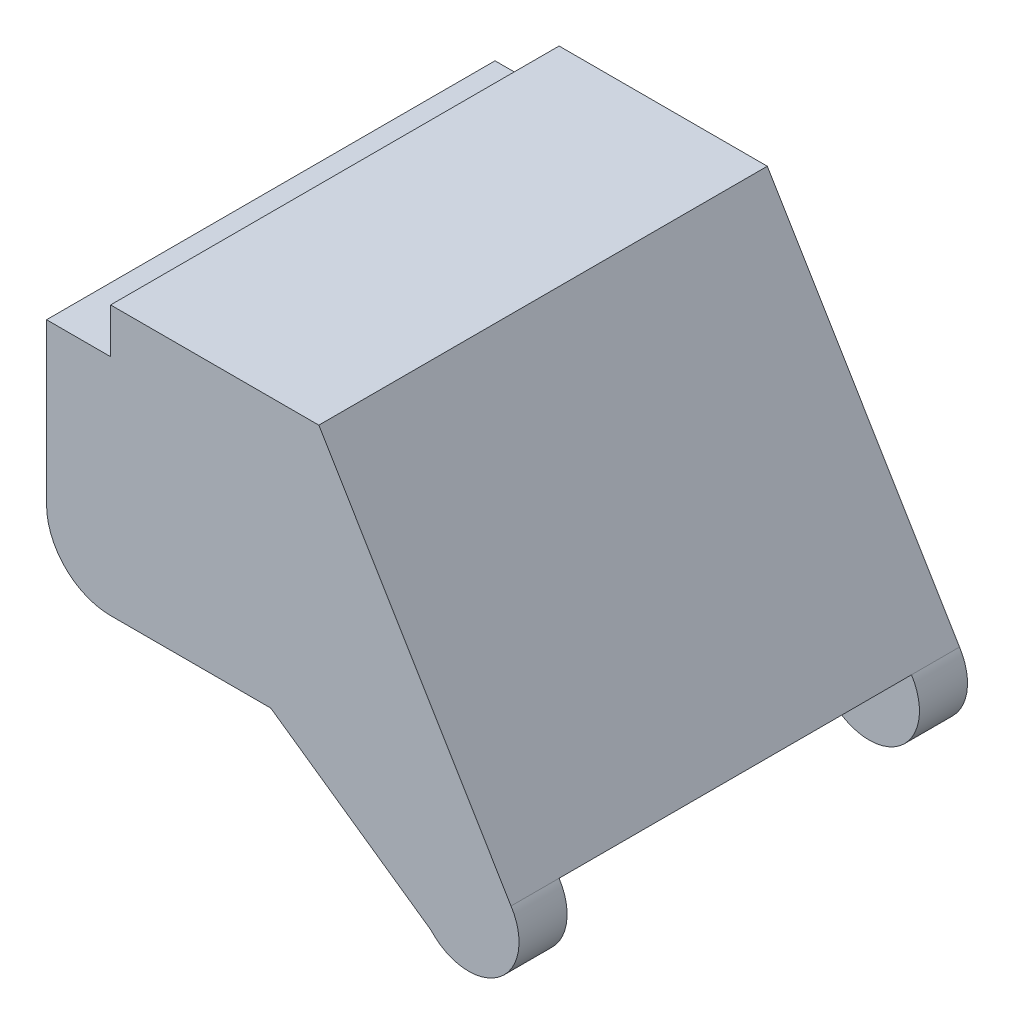
ISO-10303-21;
HEADER;
FILE_DESCRIPTION(('STEP AP214'),'2;1');
FILE_NAME('part.step','',(''),(''),'','','');
FILE_SCHEMA(('AUTOMOTIVE_DESIGN { 1 0 10303 214 1 1 1 1 }'));
ENDSEC;
DATA;
#1=APPLICATION_CONTEXT('core data for automotive mechanical design processes');
#2=APPLICATION_PROTOCOL_DEFINITION('international standard','automotive_design',2000,#1);
#3=PRODUCT_CONTEXT('',#1,'mechanical');
#4=PRODUCT('Part','Part','',(#3));
#5=PRODUCT_RELATED_PRODUCT_CATEGORY('part','',(#4));
#6=PRODUCT_DEFINITION_FORMATION('','',#4);
#7=PRODUCT_DEFINITION_CONTEXT('part definition',#1,'design');
#8=PRODUCT_DEFINITION('design','',#6,#7);
#9=PRODUCT_DEFINITION_SHAPE('','',#8);
#10=(LENGTH_UNIT() NAMED_UNIT(*) SI_UNIT(.MILLI.,.METRE.));
#11=(NAMED_UNIT(*) PLANE_ANGLE_UNIT() SI_UNIT($,.RADIAN.));
#12=(NAMED_UNIT(*) SI_UNIT($,.STERADIAN.) SOLID_ANGLE_UNIT());
#13=UNCERTAINTY_MEASURE_WITH_UNIT(LENGTH_MEASURE(1.E-05),#10,'distance_accuracy_value','');
#14=(GEOMETRIC_REPRESENTATION_CONTEXT(3) GLOBAL_UNCERTAINTY_ASSIGNED_CONTEXT((#13)) GLOBAL_UNIT_ASSIGNED_CONTEXT((#10,
#11,#12)) REPRESENTATION_CONTEXT('',''));
#15=CARTESIAN_POINT('',(0.,0.,0.));
#16=DIRECTION('',(0.,0.,1.));
#17=DIRECTION('',(1.,0.,0.));
#18=AXIS2_PLACEMENT_3D('',#15,#16,#17);
#19=CARTESIAN_POINT('',(0.,7.,14.));
#20=DIRECTION('',(1.,0.,0.));
#21=DIRECTION('',(0.,1.,0.));
#22=AXIS2_PLACEMENT_3D('',#19,#20,#21);
#23=PLANE('',#22);
#24=DIRECTION('',(0.,-1.,0.));
#25=VECTOR('',#24,1.);
#26=CARTESIAN_POINT('',(0.,-2.45143228970305,1.5));
#27=LINE('',#26,#25);
#28=CARTESIAN_POINT('',(0.,5.5,1.5));
#29=VERTEX_POINT('',#28);
#30=CARTESIAN_POINT('',(0.,2.00000000000001,1.5));
#31=VERTEX_POINT('',#30);
#32=EDGE_CURVE('E365',#29,#31,#27,.T.);
#33=ORIENTED_EDGE('',*,*,#32,.F.);
#34=DIRECTION('',(0.,0.,-1.));
#35=VECTOR('',#34,1.);
#36=CARTESIAN_POINT('',(0.,5.5,14.));
#37=LINE('',#36,#35);
#38=CARTESIAN_POINT('',(0.,5.5,12.5));
#39=VERTEX_POINT('',#38);
#40=EDGE_CURVE('E165',#39,#29,#37,.T.);
#41=ORIENTED_EDGE('',*,*,#40,.F.);
#42=DIRECTION('',(0.,-1.,0.));
#43=VECTOR('',#42,1.);
#44=CARTESIAN_POINT('',(0.,-2.45143228970305,12.5));
#45=LINE('',#44,#43);
#46=CARTESIAN_POINT('',(0.,2.00000000000001,12.5));
#47=VERTEX_POINT('',#46);
#48=EDGE_CURVE('E268',#39,#47,#45,.T.);
#49=ORIENTED_EDGE('',*,*,#48,.T.);
#50=DIRECTION('',(0.,0.,-1.));
#51=VECTOR('',#50,1.);
#52=CARTESIAN_POINT('',(0.,2.00000000000001,14.));
#53=LINE('',#52,#51);
#54=CARTESIAN_POINT('',(0.,2.00000000000001,14.));
#55=VERTEX_POINT('',#54);
#56=EDGE_CURVE('E50',#55,#47,#53,.T.);
#57=ORIENTED_EDGE('',*,*,#56,.F.);
#58=DIRECTION('',(0.,-1.,0.));
#59=VECTOR('',#58,1.);
#60=CARTESIAN_POINT('',(0.,7.,14.));
#61=LINE('',#60,#59);
#62=CARTESIAN_POINT('',(0.,7.,14.));
#63=VERTEX_POINT('',#62);
#64=EDGE_CURVE('E110',#63,#55,#61,.T.);
#65=ORIENTED_EDGE('',*,*,#64,.F.);
#66=DIRECTION('',(0.,0.,-1.));
#67=VECTOR('',#66,1.);
#68=CARTESIAN_POINT('',(0.,7.,14.));
#69=LINE('',#68,#67);
#70=CARTESIAN_POINT('',(0.,7.,0.));
#71=VERTEX_POINT('',#70);
#72=EDGE_CURVE('E11',#63,#71,#69,.T.);
#73=ORIENTED_EDGE('',*,*,#72,.T.);
#74=DIRECTION('',(0.,-1.,0.));
#75=VECTOR('',#74,1.);
#76=CARTESIAN_POINT('',(0.,7.,0.));
#77=LINE('',#76,#75);
#78=CARTESIAN_POINT('',(0.,2.00000000000001,0.));
#79=VERTEX_POINT('',#78);
#80=EDGE_CURVE('E164',#71,#79,#77,.T.);
#81=ORIENTED_EDGE('',*,*,#80,.T.);
#82=EDGE_CURVE('E215',#31,#79,#53,.T.);
#83=ORIENTED_EDGE('',*,*,#82,.F.);
#84=EDGE_LOOP('',(#33,#41,#49,#57,#65,#73,#81,#83));
#85=FACE_BOUND('',#84,.T.);
#86=ADVANCED_FACE('F41',(#85),#23,.F.);
#87=CARTESIAN_POINT('',(2.,2.,14.));
#88=DIRECTION('',(0.,0.,-1.));
#89=DIRECTION('',(-1.,0.,0.));
#90=AXIS2_PLACEMENT_3D('',#87,#88,#89);
#91=CYLINDRICAL_SURFACE('',#90,2.);
#92=CARTESIAN_POINT('',(2.,2.,1.5));
#93=DIRECTION('',(0.,0.,-1.));
#94=DIRECTION('',(-1.,0.,0.));
#95=AXIS2_PLACEMENT_3D('',#92,#93,#94);
#96=CIRCLE('',#95,2.);
#97=CARTESIAN_POINT('',(2.00000000000001,0.,1.5));
#98=VERTEX_POINT('',#97);
#99=EDGE_CURVE('E232',#31,#98,#96,.F.);
#100=ORIENTED_EDGE('',*,*,#99,.F.);
#101=ORIENTED_EDGE('',*,*,#82,.T.);
#102=CARTESIAN_POINT('',(2.,2.,0.));
#103=DIRECTION('',(0.,0.,1.));
#104=DIRECTION('',(1.,0.,0.));
#105=AXIS2_PLACEMENT_3D('',#102,#103,#104);
#106=CIRCLE('',#105,2.);
#107=CARTESIAN_POINT('',(2.00000000000001,0.,0.));
#108=VERTEX_POINT('',#107);
#109=EDGE_CURVE('E169',#79,#108,#106,.T.);
#110=ORIENTED_EDGE('',*,*,#109,.T.);
#111=DIRECTION('',(0.,0.,-1.));
#112=VECTOR('',#111,1.);
#113=CARTESIAN_POINT('',(2.00000000000001,0.,14.));
#114=LINE('',#113,#112);
#115=EDGE_CURVE('E211',#98,#108,#114,.T.);
#116=ORIENTED_EDGE('',*,*,#115,.F.);
#117=EDGE_LOOP('',(#100,#101,#110,#116));
#118=FACE_BOUND('',#117,.T.);
#119=ADVANCED_FACE('F226',(#118),#91,.T.);
#120=CARTESIAN_POINT('',(2.00000000000001,0.,14.));
#121=DIRECTION('',(0.,1.,0.));
#122=DIRECTION('',(0.,0.,1.));
#123=AXIS2_PLACEMENT_3D('',#120,#121,#122);
#124=PLANE('',#123);
#125=DIRECTION('',(1.,0.,0.));
#126=VECTOR('',#125,1.);
#127=CARTESIAN_POINT('',(13.1750885401743,0.,1.5));
#128=LINE('',#127,#126);
#129=CARTESIAN_POINT('',(7.,0.,1.5));
#130=VERTEX_POINT('',#129);
#131=EDGE_CURVE('E247',#98,#130,#128,.T.);
#132=ORIENTED_EDGE('',*,*,#131,.F.);
#133=ORIENTED_EDGE('',*,*,#115,.T.);
#134=DIRECTION('',(1.,0.,0.));
#135=VECTOR('',#134,1.);
#136=CARTESIAN_POINT('',(2.00000000000001,0.,0.));
#137=LINE('',#136,#135);
#138=CARTESIAN_POINT('',(7.,0.,0.));
#139=VERTEX_POINT('',#138);
#140=EDGE_CURVE('E173',#108,#139,#137,.T.);
#141=ORIENTED_EDGE('',*,*,#140,.T.);
#142=DIRECTION('',(0.,0.,-1.));
#143=VECTOR('',#142,1.);
#144=CARTESIAN_POINT('',(7.,0.,14.));
#145=LINE('',#144,#143);
#146=EDGE_CURVE('E206',#130,#139,#145,.T.);
#147=ORIENTED_EDGE('',*,*,#146,.F.);
#148=EDGE_LOOP('',(#132,#133,#141,#147));
#149=FACE_BOUND('',#148,.T.);
#150=ADVANCED_FACE('F243',(#149),#124,.F.);
#151=CARTESIAN_POINT('',(7.,0.,14.));
#152=DIRECTION('',(0.573462344363328,0.819231920519041,0.));
#153=DIRECTION('',(-0.819231920519041,0.573462344363328,0.));
#154=AXIS2_PLACEMENT_3D('',#151,#152,#153);
#155=PLANE('',#154);
#156=DIRECTION('',(0.819231920519041,-0.573462344363328,0.));
#157=VECTOR('',#156,1.);
#158=CARTESIAN_POINT('',(12.2960343241386,-3.707224026897,1.5));
#159=LINE('',#158,#157);
#160=CARTESIAN_POINT('',(12.,-3.5,1.5));
#161=VERTEX_POINT('',#160);
#162=EDGE_CURVE('E373',#130,#161,#159,.T.);
#163=ORIENTED_EDGE('',*,*,#162,.F.);
#164=ORIENTED_EDGE('',*,*,#146,.T.);
#165=DIRECTION('',(0.819231920519041,-0.573462344363328,0.));
#166=VECTOR('',#165,1.);
#167=CARTESIAN_POINT('',(7.,0.,0.));
#168=LINE('',#167,#166);
#169=CARTESIAN_POINT('',(12.,-3.5,0.));
#170=VERTEX_POINT('',#169);
#171=EDGE_CURVE('E177',#139,#170,#168,.T.);
#172=ORIENTED_EDGE('',*,*,#171,.T.);
#173=DIRECTION('',(0.,0.,-1.));
#174=VECTOR('',#173,1.);
#175=CARTESIAN_POINT('',(12.,-3.5,14.));
#176=LINE('',#175,#174);
#177=EDGE_CURVE('E200',#161,#170,#176,.T.);
#178=ORIENTED_EDGE('',*,*,#177,.F.);
#179=EDGE_LOOP('',(#163,#164,#172,#178));
#180=FACE_BOUND('',#179,.T.);
#181=ADVANCED_FACE('F456',(#180),#155,.F.);
#182=CARTESIAN_POINT('',(13.1750885401743,-2.45143228970307,14.));
#183=DIRECTION('',(0.,0.,-1.));
#184=DIRECTION('',(-1.,0.,0.));
#185=AXIS2_PLACEMENT_3D('',#182,#183,#184);
#186=CYLINDRICAL_SURFACE('',#185,1.57490549568106);
#187=CARTESIAN_POINT('',(13.1750885401743,-2.45143228970307,1.5));
#188=DIRECTION('',(0.,0.,-1.));
#189=DIRECTION('',(-1.,0.,0.));
#190=AXIS2_PLACEMENT_3D('',#187,#188,#189);
#191=CIRCLE('',#190,1.57490549568106);
#192=CARTESIAN_POINT('',(14.5,-1.6,1.5));
#193=VERTEX_POINT('',#192);
#194=EDGE_CURVE('E361',#161,#193,#191,.F.);
#195=ORIENTED_EDGE('',*,*,#194,.F.);
#196=ORIENTED_EDGE('',*,*,#177,.T.);
#197=CARTESIAN_POINT('',(13.1750885401743,-2.45143228970307,0.));
#198=DIRECTION('',(0.,0.,1.));
#199=DIRECTION('',(-1.,0.,0.));
#200=AXIS2_PLACEMENT_3D('',#197,#198,#199);
#201=CIRCLE('',#200,1.57490549568106);
#202=CARTESIAN_POINT('',(14.5,-1.6,0.));
#203=VERTEX_POINT('',#202);
#204=EDGE_CURVE('E181',#170,#203,#201,.T.);
#205=ORIENTED_EDGE('',*,*,#204,.T.);
#206=DIRECTION('',(0.,0.,-1.));
#207=VECTOR('',#206,1.);
#208=CARTESIAN_POINT('',(14.5,-1.6,14.));
#209=LINE('',#208,#207);
#210=EDGE_CURVE('E149',#193,#203,#209,.T.);
#211=ORIENTED_EDGE('',*,*,#210,.F.);
#212=EDGE_LOOP('',(#195,#196,#205,#211));
#213=FACE_BOUND('',#212,.T.);
#214=ADVANCED_FACE('F257',(#213),#186,.T.);
#215=CARTESIAN_POINT('',(0.,7.,14.));
#216=DIRECTION('',(0.,-1.,0.));
#217=DIRECTION('',(0.,0.,-1.));
#218=AXIS2_PLACEMENT_3D('',#215,#216,#217);
#219=PLANE('',#218);
#220=DIRECTION('',(-1.,0.,0.));
#221=VECTOR('',#220,1.);
#222=CARTESIAN_POINT('',(0.,7.,0.));
#223=LINE('',#222,#221);
#224=CARTESIAN_POINT('',(2.,7.,0.));
#225=VERTEX_POINT('',#224);
#226=EDGE_CURVE('E160',#225,#71,#223,.T.);
#227=ORIENTED_EDGE('',*,*,#226,.T.);
#228=ORIENTED_EDGE('',*,*,#72,.F.);
#229=DIRECTION('',(-1.,0.,0.));
#230=VECTOR('',#229,1.);
#231=CARTESIAN_POINT('',(0.,7.,14.));
#232=LINE('',#231,#230);
#233=CARTESIAN_POINT('',(2.,7.,14.));
#234=VERTEX_POINT('',#233);
#235=EDGE_CURVE('E192',#234,#63,#232,.T.);
#236=ORIENTED_EDGE('',*,*,#235,.F.);
#237=DIRECTION('',(0.,0.,-1.));
#238=VECTOR('',#237,1.);
#239=CARTESIAN_POINT('',(2.,7.,14.));
#240=LINE('',#239,#238);
#241=EDGE_CURVE('E156',#234,#225,#240,.T.);
#242=ORIENTED_EDGE('',*,*,#241,.T.);
#243=EDGE_LOOP('',(#227,#228,#236,#242));
#244=FACE_BOUND('',#243,.T.);
#245=ADVANCED_FACE('F43',(#244),#219,.F.);
#246=ORIENTED_EDGE('',*,*,#56,.T.);
#247=CARTESIAN_POINT('',(2.,2.,12.5));
#248=DIRECTION('',(0.,0.,-1.));
#249=DIRECTION('',(-1.,0.,0.));
#250=AXIS2_PLACEMENT_3D('',#247,#248,#249);
#251=CIRCLE('',#250,2.);
#252=CARTESIAN_POINT('',(2.00000000000001,0.,12.5));
#253=VERTEX_POINT('',#252);
#254=EDGE_CURVE('E310',#47,#253,#251,.F.);
#255=ORIENTED_EDGE('',*,*,#254,.T.);
#256=CARTESIAN_POINT('',(2.00000000000001,0.,14.));
#257=VERTEX_POINT('',#256);
#258=EDGE_CURVE('E212',#257,#253,#114,.T.);
#259=ORIENTED_EDGE('',*,*,#258,.F.);
#260=CARTESIAN_POINT('',(2.,2.,14.));
#261=DIRECTION('',(0.,0.,1.));
#262=DIRECTION('',(1.,0.,0.));
#263=AXIS2_PLACEMENT_3D('',#260,#261,#262);
#264=CIRCLE('',#263,2.);
#265=EDGE_CURVE('E265',#55,#257,#264,.T.);
#266=ORIENTED_EDGE('',*,*,#265,.F.);
#267=EDGE_LOOP('',(#246,#255,#259,#266));
#268=FACE_BOUND('',#267,.T.);
#269=ADVANCED_FACE('F433',(#268),#91,.T.);
#270=ORIENTED_EDGE('',*,*,#258,.T.);
#271=DIRECTION('',(1.,0.,0.));
#272=VECTOR('',#271,1.);
#273=CARTESIAN_POINT('',(13.1750885401743,0.,12.5));
#274=LINE('',#273,#272);
#275=CARTESIAN_POINT('',(7.,0.,12.5));
#276=VERTEX_POINT('',#275);
#277=EDGE_CURVE('E307',#253,#276,#274,.T.);
#278=ORIENTED_EDGE('',*,*,#277,.T.);
#279=CARTESIAN_POINT('',(7.,0.,14.));
#280=VERTEX_POINT('',#279);
#281=EDGE_CURVE('E207',#280,#276,#145,.T.);
#282=ORIENTED_EDGE('',*,*,#281,.F.);
#283=DIRECTION('',(1.,0.,0.));
#284=VECTOR('',#283,1.);
#285=CARTESIAN_POINT('',(2.00000000000001,0.,14.));
#286=LINE('',#285,#284);
#287=EDGE_CURVE('E273',#257,#280,#286,.T.);
#288=ORIENTED_EDGE('',*,*,#287,.F.);
#289=EDGE_LOOP('',(#270,#278,#282,#288));
#290=FACE_BOUND('',#289,.T.);
#291=ADVANCED_FACE('F432',(#290),#124,.F.);
#292=ORIENTED_EDGE('',*,*,#281,.T.);
#293=DIRECTION('',(0.819231920519041,-0.573462344363328,0.));
#294=VECTOR('',#293,1.);
#295=CARTESIAN_POINT('',(12.2960343241386,-3.707224026897,12.5));
#296=LINE('',#295,#294);
#297=CARTESIAN_POINT('',(12.,-3.5,12.5));
#298=VERTEX_POINT('',#297);
#299=EDGE_CURVE('E288',#276,#298,#296,.T.);
#300=ORIENTED_EDGE('',*,*,#299,.T.);
#301=CARTESIAN_POINT('',(12.,-3.5,14.));
#302=VERTEX_POINT('',#301);
#303=EDGE_CURVE('E202',#302,#298,#176,.T.);
#304=ORIENTED_EDGE('',*,*,#303,.F.);
#305=DIRECTION('',(0.819231920519041,-0.573462344363328,0.));
#306=VECTOR('',#305,1.);
#307=CARTESIAN_POINT('',(7.,0.,14.));
#308=LINE('',#307,#306);
#309=EDGE_CURVE('E276',#280,#302,#308,.T.);
#310=ORIENTED_EDGE('',*,*,#309,.F.);
#311=EDGE_LOOP('',(#292,#300,#304,#310));
#312=FACE_BOUND('',#311,.T.);
#313=ADVANCED_FACE('F285',(#312),#155,.F.);
#314=ORIENTED_EDGE('',*,*,#303,.T.);
#315=CARTESIAN_POINT('',(13.1750885401743,-2.45143228970307,12.5));
#316=DIRECTION('',(0.,0.,-1.));
#317=DIRECTION('',(-1.,0.,0.));
#318=AXIS2_PLACEMENT_3D('',#315,#316,#317);
#319=CIRCLE('',#318,1.57490549568106);
#320=CARTESIAN_POINT('',(14.5,-1.6,12.5));
#321=VERTEX_POINT('',#320);
#322=EDGE_CURVE('E292',#298,#321,#319,.F.);
#323=ORIENTED_EDGE('',*,*,#322,.T.);
#324=CARTESIAN_POINT('',(14.5,-1.6,14.));
#325=VERTEX_POINT('',#324);
#326=EDGE_CURVE('E197',#325,#321,#209,.T.);
#327=ORIENTED_EDGE('',*,*,#326,.F.);
#328=CARTESIAN_POINT('',(13.1750885401743,-2.45143228970307,14.));
#329=DIRECTION('',(0.,0.,1.));
#330=DIRECTION('',(-1.,0.,0.));
#331=AXIS2_PLACEMENT_3D('',#328,#329,#330);
#332=CIRCLE('',#331,1.57490549568106);
#333=EDGE_CURVE('E135',#302,#325,#332,.T.);
#334=ORIENTED_EDGE('',*,*,#333,.F.);
#335=EDGE_LOOP('',(#314,#323,#327,#334));
#336=FACE_BOUND('',#335,.T.);
#337=ADVANCED_FACE('F291',(#336),#186,.T.);
#338=CARTESIAN_POINT('',(8.5,8.4,14.));
#339=DIRECTION('',(-0.857492925712544,-0.514495755427527,0.));
#340=DIRECTION('',(0.514495755427527,-0.857492925712544,0.));
#341=AXIS2_PLACEMENT_3D('',#338,#339,#340);
#342=PLANE('',#341);
#343=DIRECTION('',(-0.514495755427527,0.857492925712544,0.));
#344=VECTOR('',#343,1.);
#345=CARTESIAN_POINT('',(8.5,8.4,0.));
#346=LINE('',#345,#344);
#347=CARTESIAN_POINT('',(8.5,8.4,0.));
#348=VERTEX_POINT('',#347);
#349=EDGE_CURVE('E145',#203,#348,#346,.T.);
#350=ORIENTED_EDGE('',*,*,#349,.T.);
#351=DIRECTION('',(0.,0.,-1.));
#352=VECTOR('',#351,1.);
#353=CARTESIAN_POINT('',(8.5,8.4,14.));
#354=LINE('',#353,#352);
#355=CARTESIAN_POINT('',(8.5,8.4,14.));
#356=VERTEX_POINT('',#355);
#357=EDGE_CURVE('E142',#356,#348,#354,.T.);
#358=ORIENTED_EDGE('',*,*,#357,.F.);
#359=DIRECTION('',(-0.514495755427527,0.857492925712544,0.));
#360=VECTOR('',#359,1.);
#361=CARTESIAN_POINT('',(8.5,8.4,14.));
#362=LINE('',#361,#360);
#363=EDGE_CURVE('E128',#325,#356,#362,.T.);
#364=ORIENTED_EDGE('',*,*,#363,.F.);
#365=ORIENTED_EDGE('',*,*,#326,.T.);
#366=EDGE_CURVE('E201',#321,#193,#209,.T.);
#367=ORIENTED_EDGE('',*,*,#366,.T.);
#368=ORIENTED_EDGE('',*,*,#210,.T.);
#369=EDGE_LOOP('',(#350,#358,#364,#365,#367,#368));
#370=FACE_BOUND('',#369,.T.);
#371=ADVANCED_FACE('F143',(#370),#342,.F.);
#372=CARTESIAN_POINT('',(2.,8.4,14.));
#373=DIRECTION('',(0.,-1.,0.));
#374=DIRECTION('',(0.,0.,-1.));
#375=AXIS2_PLACEMENT_3D('',#372,#373,#374);
#376=PLANE('',#375);
#377=DIRECTION('',(-1.,0.,0.));
#378=VECTOR('',#377,1.);
#379=CARTESIAN_POINT('',(2.,8.4,0.));
#380=LINE('',#379,#378);
#381=CARTESIAN_POINT('',(2.,8.4,0.));
#382=VERTEX_POINT('',#381);
#383=EDGE_CURVE('E187',#348,#382,#380,.T.);
#384=ORIENTED_EDGE('',*,*,#383,.T.);
#385=DIRECTION('',(0.,0.,-1.));
#386=VECTOR('',#385,1.);
#387=CARTESIAN_POINT('',(2.,8.4,14.));
#388=LINE('',#387,#386);
#389=CARTESIAN_POINT('',(2.,8.4,14.));
#390=VERTEX_POINT('',#389);
#391=EDGE_CURVE('E150',#390,#382,#388,.T.);
#392=ORIENTED_EDGE('',*,*,#391,.F.);
#393=DIRECTION('',(-1.,0.,0.));
#394=VECTOR('',#393,1.);
#395=CARTESIAN_POINT('',(2.,8.4,14.));
#396=LINE('',#395,#394);
#397=EDGE_CURVE('E132',#356,#390,#396,.T.);
#398=ORIENTED_EDGE('',*,*,#397,.F.);
#399=ORIENTED_EDGE('',*,*,#357,.T.);
#400=EDGE_LOOP('',(#384,#392,#398,#399));
#401=FACE_BOUND('',#400,.T.);
#402=ADVANCED_FACE('F152',(#401),#376,.F.);
#403=CARTESIAN_POINT('',(2.,7.,14.));
#404=DIRECTION('',(1.,0.,0.));
#405=DIRECTION('',(0.,0.,-1.));
#406=AXIS2_PLACEMENT_3D('',#403,#404,#405);
#407=PLANE('',#406);
#408=DIRECTION('',(0.,-1.,0.));
#409=VECTOR('',#408,1.);
#410=CARTESIAN_POINT('',(2.,7.,0.));
#411=LINE('',#410,#409);
#412=EDGE_CURVE('E102',#382,#225,#411,.T.);
#413=ORIENTED_EDGE('',*,*,#412,.T.);
#414=ORIENTED_EDGE('',*,*,#241,.F.);
#415=DIRECTION('',(0.,-1.,0.));
#416=VECTOR('',#415,1.);
#417=CARTESIAN_POINT('',(2.,7.,14.));
#418=LINE('',#417,#416);
#419=EDGE_CURVE('E66',#390,#234,#418,.T.);
#420=ORIENTED_EDGE('',*,*,#419,.F.);
#421=ORIENTED_EDGE('',*,*,#391,.T.);
#422=EDGE_LOOP('',(#413,#414,#420,#421));
#423=FACE_BOUND('',#422,.T.);
#424=ADVANCED_FACE('F259',(#423),#407,.F.);
#425=CARTESIAN_POINT('',(13.1750885401743,-2.45143228970307,14.));
#426=DIRECTION('',(0.,0.,-1.));
#427=DIRECTION('',(-1.,0.,0.));
#428=AXIS2_PLACEMENT_3D('',#425,#426,#427);
#429=PLANE('',#428);
#430=ORIENTED_EDGE('',*,*,#235,.T.);
#431=ORIENTED_EDGE('',*,*,#64,.T.);
#432=ORIENTED_EDGE('',*,*,#265,.T.);
#433=ORIENTED_EDGE('',*,*,#287,.T.);
#434=ORIENTED_EDGE('',*,*,#309,.T.);
#435=ORIENTED_EDGE('',*,*,#333,.T.);
#436=ORIENTED_EDGE('',*,*,#363,.T.);
#437=ORIENTED_EDGE('',*,*,#397,.T.);
#438=ORIENTED_EDGE('',*,*,#419,.T.);
#439=EDGE_LOOP('',(#430,#431,#432,#433,#434,#435,#436,#437,#438));
#440=FACE_BOUND('',#439,.T.);
#441=ADVANCED_FACE('F130',(#440),#429,.F.);
#442=CARTESIAN_POINT('',(13.1750885401743,-2.45143228970307,0.));
#443=DIRECTION('',(0.,0.,-1.));
#444=DIRECTION('',(-1.,0.,0.));
#445=AXIS2_PLACEMENT_3D('',#442,#443,#444);
#446=PLANE('',#445);
#447=ORIENTED_EDGE('',*,*,#226,.F.);
#448=ORIENTED_EDGE('',*,*,#412,.F.);
#449=ORIENTED_EDGE('',*,*,#383,.F.);
#450=ORIENTED_EDGE('',*,*,#349,.F.);
#451=ORIENTED_EDGE('',*,*,#204,.F.);
#452=ORIENTED_EDGE('',*,*,#171,.F.);
#453=ORIENTED_EDGE('',*,*,#140,.F.);
#454=ORIENTED_EDGE('',*,*,#109,.F.);
#455=ORIENTED_EDGE('',*,*,#80,.F.);
#456=EDGE_LOOP('',(#447,#448,#449,#450,#451,#452,#453,#454,#455));
#457=FACE_BOUND('',#456,.T.);
#458=ADVANCED_FACE('F237',(#457),#446,.T.);
#459=CARTESIAN_POINT('',(0.,5.5,14.));
#460=DIRECTION('',(0.,-1.,0.));
#461=DIRECTION('',(0.,0.,-1.));
#462=AXIS2_PLACEMENT_3D('',#459,#460,#461);
#463=PLANE('',#462);
#464=DIRECTION('',(-1.,0.,0.));
#465=VECTOR('',#464,1.);
#466=CARTESIAN_POINT('',(13.1750885401743,5.5,1.5));
#467=LINE('',#466,#465);
#468=CARTESIAN_POINT('',(3.5,5.5,1.5));
#469=VERTEX_POINT('',#468);
#470=EDGE_CURVE('E335',#469,#29,#467,.T.);
#471=ORIENTED_EDGE('',*,*,#470,.F.);
#472=DIRECTION('',(0.,0.,-1.));
#473=VECTOR('',#472,1.);
#474=CARTESIAN_POINT('',(3.5,5.5,14.));
#475=LINE('',#474,#473);
#476=CARTESIAN_POINT('',(3.5,5.5,12.5));
#477=VERTEX_POINT('',#476);
#478=EDGE_CURVE('E336',#477,#469,#475,.T.);
#479=ORIENTED_EDGE('',*,*,#478,.F.);
#480=DIRECTION('',(-1.,0.,0.));
#481=VECTOR('',#480,1.);
#482=CARTESIAN_POINT('',(13.1750885401743,5.5,12.5));
#483=LINE('',#482,#481);
#484=EDGE_CURVE('E317',#477,#39,#483,.T.);
#485=ORIENTED_EDGE('',*,*,#484,.T.);
#486=ORIENTED_EDGE('',*,*,#40,.T.);
#487=EDGE_LOOP('',(#471,#479,#485,#486));
#488=FACE_BOUND('',#487,.T.);
#489=ADVANCED_FACE('F507',(#488),#463,.T.);
#490=CARTESIAN_POINT('',(13.1750885401743,-2.45143228970307,14.));
#491=DIRECTION('',(0.,0.,-1.));
#492=DIRECTION('',(-1.,0.,0.));
#493=AXIS2_PLACEMENT_3D('',#490,#491,#492);
#494=CYLINDRICAL_SURFACE('',#493,1.57490549568106);
#495=CARTESIAN_POINT('',(12.4292972966759,-1.06430477521585,12.5));
#496=VERTEX_POINT('',#495);
#497=EDGE_CURVE('E57',#321,#496,#319,.F.);
#498=ORIENTED_EDGE('',*,*,#497,.T.);
#499=DIRECTION('',(0.,0.,-1.));
#500=VECTOR('',#499,1.);
#501=CARTESIAN_POINT('',(12.4292972966759,-1.06430477521585,12.5));
#502=LINE('',#501,#500);
#503=CARTESIAN_POINT('',(12.4292972966759,-1.06430477521585,1.5));
#504=VERTEX_POINT('',#503);
#505=EDGE_CURVE('E303',#496,#504,#502,.T.);
#506=ORIENTED_EDGE('',*,*,#505,.T.);
#507=EDGE_CURVE('E376',#193,#504,#191,.F.);
#508=ORIENTED_EDGE('',*,*,#507,.F.);
#509=ORIENTED_EDGE('',*,*,#366,.F.);
#510=EDGE_LOOP('',(#498,#506,#508,#509));
#511=FACE_BOUND('',#510,.T.);
#512=ADVANCED_FACE('F393',(#511),#494,.F.);
#513=CARTESIAN_POINT('',(7.21376061143118,7.62825636685871,14.));
#514=DIRECTION('',(-0.857492925712544,-0.514495755427527,0.));
#515=DIRECTION('',(0.514495755427527,-0.857492925712544,0.));
#516=AXIS2_PLACEMENT_3D('',#513,#514,#515);
#517=PLANE('',#516);
#518=DIRECTION('',(-0.514495755427527,0.857492925712544,0.));
#519=VECTOR('',#518,1.);
#520=CARTESIAN_POINT('',(13.2386806469346,-2.41327702564693,1.5));
#521=LINE('',#520,#519);
#522=CARTESIAN_POINT('',(7.65071443154641,6.9,1.5));
#523=VERTEX_POINT('',#522);
#524=EDGE_CURVE('E352',#504,#523,#521,.T.);
#525=ORIENTED_EDGE('',*,*,#524,.F.);
#526=ORIENTED_EDGE('',*,*,#505,.F.);
#527=DIRECTION('',(-0.514495755427527,0.857492925712544,0.));
#528=VECTOR('',#527,1.);
#529=CARTESIAN_POINT('',(13.2386806469346,-2.41327702564693,12.5));
#530=LINE('',#529,#528);
#531=CARTESIAN_POINT('',(7.65071443154641,6.9,12.5));
#532=VERTEX_POINT('',#531);
#533=EDGE_CURVE('E294',#496,#532,#530,.T.);
#534=ORIENTED_EDGE('',*,*,#533,.T.);
#535=DIRECTION('',(0.,0.,-1.));
#536=VECTOR('',#535,1.);
#537=CARTESIAN_POINT('',(7.65071443154641,6.9,14.));
#538=LINE('',#537,#536);
#539=EDGE_CURVE('E348',#532,#523,#538,.T.);
#540=ORIENTED_EDGE('',*,*,#539,.T.);
#541=EDGE_LOOP('',(#525,#526,#534,#540));
#542=FACE_BOUND('',#541,.T.);
#543=ADVANCED_FACE('F397',(#542),#517,.T.);
#544=CARTESIAN_POINT('',(2.,6.9,14.));
#545=DIRECTION('',(0.,-1.,0.));
#546=DIRECTION('',(0.,0.,-1.));
#547=AXIS2_PLACEMENT_3D('',#544,#545,#546);
#548=PLANE('',#547);
#549=DIRECTION('',(-1.,0.,0.));
#550=VECTOR('',#549,1.);
#551=CARTESIAN_POINT('',(13.1750885401743,6.9,1.5));
#552=LINE('',#551,#550);
#553=CARTESIAN_POINT('',(3.5,6.9,1.5));
#554=VERTEX_POINT('',#553);
#555=EDGE_CURVE('E331',#523,#554,#552,.T.);
#556=ORIENTED_EDGE('',*,*,#555,.F.);
#557=ORIENTED_EDGE('',*,*,#539,.F.);
#558=DIRECTION('',(-1.,0.,0.));
#559=VECTOR('',#558,1.);
#560=CARTESIAN_POINT('',(13.1750885401743,6.9,12.5));
#561=LINE('',#560,#559);
#562=CARTESIAN_POINT('',(3.5,6.9,12.5));
#563=VERTEX_POINT('',#562);
#564=EDGE_CURVE('E299',#532,#563,#561,.T.);
#565=ORIENTED_EDGE('',*,*,#564,.T.);
#566=DIRECTION('',(0.,0.,-1.));
#567=VECTOR('',#566,1.);
#568=CARTESIAN_POINT('',(3.5,6.9,14.));
#569=LINE('',#568,#567);
#570=EDGE_CURVE('E339',#563,#554,#569,.T.);
#571=ORIENTED_EDGE('',*,*,#570,.T.);
#572=EDGE_LOOP('',(#556,#557,#565,#571));
#573=FACE_BOUND('',#572,.T.);
#574=ADVANCED_FACE('F405',(#573),#548,.T.);
#575=CARTESIAN_POINT('',(3.5,7.,14.));
#576=DIRECTION('',(1.,0.,0.));
#577=DIRECTION('',(0.,0.,-1.));
#578=AXIS2_PLACEMENT_3D('',#575,#576,#577);
#579=PLANE('',#578);
#580=DIRECTION('',(0.,-1.,0.));
#581=VECTOR('',#580,1.);
#582=CARTESIAN_POINT('',(3.5,-2.45143228970307,1.5));
#583=LINE('',#582,#581);
#584=EDGE_CURVE('E322',#554,#469,#583,.T.);
#585=ORIENTED_EDGE('',*,*,#584,.F.);
#586=ORIENTED_EDGE('',*,*,#570,.F.);
#587=DIRECTION('',(0.,-1.,0.));
#588=VECTOR('',#587,1.);
#589=CARTESIAN_POINT('',(3.5,-2.45143228970307,12.5));
#590=LINE('',#589,#588);
#591=EDGE_CURVE('E340',#563,#477,#590,.T.);
#592=ORIENTED_EDGE('',*,*,#591,.T.);
#593=ORIENTED_EDGE('',*,*,#478,.T.);
#594=EDGE_LOOP('',(#585,#586,#592,#593));
#595=FACE_BOUND('',#594,.T.);
#596=ADVANCED_FACE('F535',(#595),#579,.T.);
#597=CARTESIAN_POINT('',(13.1750885401743,-2.45143228970307,12.5));
#598=DIRECTION('',(0.,0.,-1.));
#599=DIRECTION('',(-1.,0.,0.));
#600=AXIS2_PLACEMENT_3D('',#597,#598,#599);
#601=PLANE('',#600);
#602=ORIENTED_EDGE('',*,*,#484,.F.);
#603=ORIENTED_EDGE('',*,*,#591,.F.);
#604=ORIENTED_EDGE('',*,*,#564,.F.);
#605=ORIENTED_EDGE('',*,*,#533,.F.);
#606=ORIENTED_EDGE('',*,*,#497,.F.);
#607=ORIENTED_EDGE('',*,*,#322,.F.);
#608=ORIENTED_EDGE('',*,*,#299,.F.);
#609=ORIENTED_EDGE('',*,*,#277,.F.);
#610=ORIENTED_EDGE('',*,*,#254,.F.);
#611=ORIENTED_EDGE('',*,*,#48,.F.);
#612=EDGE_LOOP('',(#602,#603,#604,#605,#606,#607,#608,#609,#610,#611));
#613=FACE_BOUND('',#612,.T.);
#614=ADVANCED_FACE('F429',(#613),#601,.T.);
#615=CARTESIAN_POINT('',(13.1750885401743,-2.45143228970307,1.5));
#616=DIRECTION('',(0.,0.,-1.));
#617=DIRECTION('',(-1.,0.,0.));
#618=AXIS2_PLACEMENT_3D('',#615,#616,#617);
#619=PLANE('',#618);
#620=ORIENTED_EDGE('',*,*,#470,.T.);
#621=ORIENTED_EDGE('',*,*,#32,.T.);
#622=ORIENTED_EDGE('',*,*,#99,.T.);
#623=ORIENTED_EDGE('',*,*,#131,.T.);
#624=ORIENTED_EDGE('',*,*,#162,.T.);
#625=ORIENTED_EDGE('',*,*,#194,.T.);
#626=ORIENTED_EDGE('',*,*,#507,.T.);
#627=ORIENTED_EDGE('',*,*,#524,.T.);
#628=ORIENTED_EDGE('',*,*,#555,.T.);
#629=ORIENTED_EDGE('',*,*,#584,.T.);
#630=EDGE_LOOP('',(#620,#621,#622,#623,#624,#625,#626,#627,#628,#629));
#631=FACE_BOUND('',#630,.T.);
#632=ADVANCED_FACE('F386',(#631),#619,.F.);
#633=CLOSED_SHELL('',(#86,#119,#150,#181,#214,#245,#269,#291,#313,#337,#371,#402,#424,#441,#458,
#489,#512,#543,#574,#596,#614,#632));
#634=MANIFOLD_SOLID_BREP('B2',#633);
#635=ADVANCED_BREP_SHAPE_REPRESENTATION('',(#18,#634),#14);
#636=SHAPE_DEFINITION_REPRESENTATION(#9,#635);
ENDSEC;
END-ISO-10303-21;
